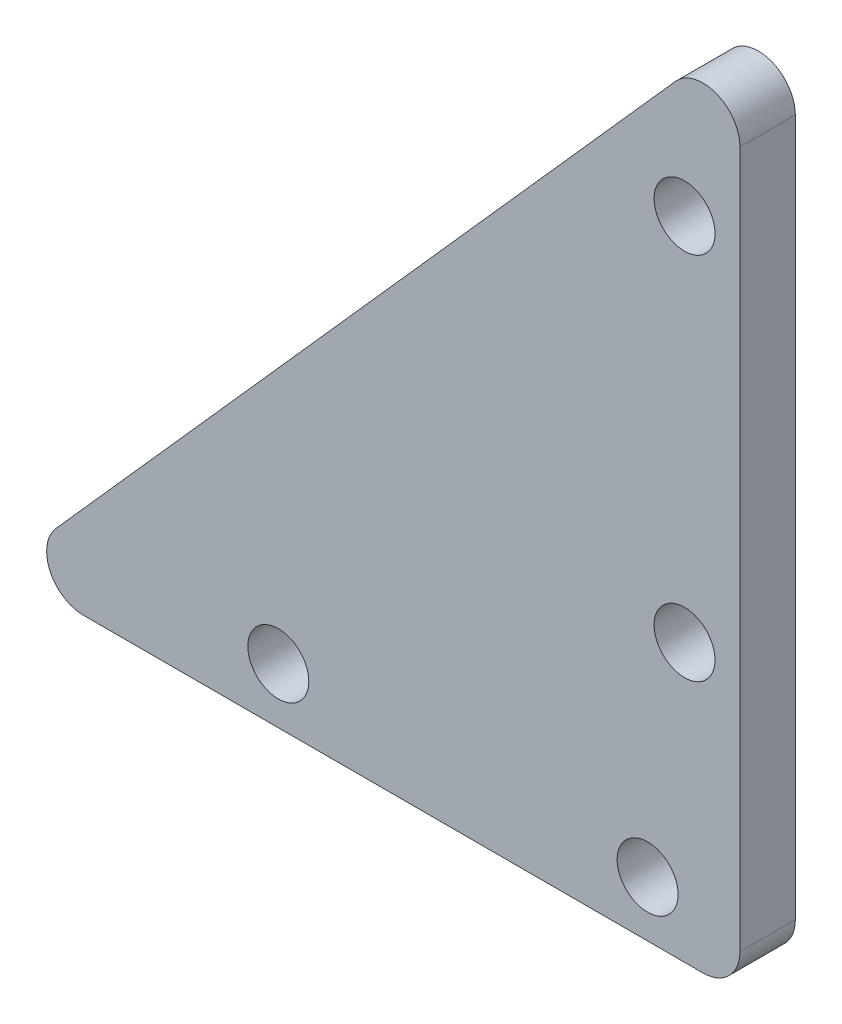
ISO-10303-21;
HEADER;
FILE_DESCRIPTION(('STEP AP214'),'2;1');
FILE_NAME('part.step','',(''),(''),'','','');
FILE_SCHEMA(('AUTOMOTIVE_DESIGN { 1 0 10303 214 1 1 1 1 }'));
ENDSEC;
DATA;
#1=APPLICATION_CONTEXT('core data for automotive mechanical design processes');
#2=APPLICATION_PROTOCOL_DEFINITION('international standard','automotive_design',2000,#1);
#3=PRODUCT_CONTEXT('',#1,'mechanical');
#4=PRODUCT('Part','Part','',(#3));
#5=PRODUCT_RELATED_PRODUCT_CATEGORY('part','',(#4));
#6=PRODUCT_DEFINITION_FORMATION('','',#4);
#7=PRODUCT_DEFINITION_CONTEXT('part definition',#1,'design');
#8=PRODUCT_DEFINITION('design','',#6,#7);
#9=PRODUCT_DEFINITION_SHAPE('','',#8);
#10=(LENGTH_UNIT() NAMED_UNIT(*) SI_UNIT(.MILLI.,.METRE.));
#11=(NAMED_UNIT(*) PLANE_ANGLE_UNIT() SI_UNIT($,.RADIAN.));
#12=(NAMED_UNIT(*) SI_UNIT($,.STERADIAN.) SOLID_ANGLE_UNIT());
#13=UNCERTAINTY_MEASURE_WITH_UNIT(LENGTH_MEASURE(1.E-05),#10,'distance_accuracy_value','');
#14=(GEOMETRIC_REPRESENTATION_CONTEXT(3) GLOBAL_UNCERTAINTY_ASSIGNED_CONTEXT((#13)) GLOBAL_UNIT_ASSIGNED_CONTEXT((#10,
#11,#12)) REPRESENTATION_CONTEXT('',''));
#15=CARTESIAN_POINT('',(0.,0.,0.));
#16=DIRECTION('',(0.,0.,1.));
#17=DIRECTION('',(1.,0.,0.));
#18=AXIS2_PLACEMENT_3D('',#15,#16,#17);
#19=CARTESIAN_POINT('',(0.,45.,3.));
#20=DIRECTION('',(-1.,0.,0.));
#21=DIRECTION('',(0.,-1.,0.));
#22=AXIS2_PLACEMENT_3D('',#19,#20,#21);
#23=PLANE('',#22);
#24=DIRECTION('',(0.,1.,0.));
#25=VECTOR('',#24,1.);
#26=CARTESIAN_POINT('',(0.,45.,3.));
#27=LINE('',#26,#25);
#28=CARTESIAN_POINT('',(0.,2.00000000000002,3.));
#29=VERTEX_POINT('',#28);
#30=CARTESIAN_POINT('',(0.,39.7396013553019,3.));
#31=VERTEX_POINT('',#30);
#32=EDGE_CURVE('E116',#29,#31,#27,.T.);
#33=ORIENTED_EDGE('',*,*,#32,.F.);
#34=DIRECTION('',(0.,0.,-1.));
#35=VECTOR('',#34,1.);
#36=CARTESIAN_POINT('',(0.,2.,3.));
#37=LINE('',#36,#35);
#38=CARTESIAN_POINT('',(0.,2.00000000000002,0.));
#39=VERTEX_POINT('',#38);
#40=EDGE_CURVE('E101',#29,#39,#37,.T.);
#41=ORIENTED_EDGE('',*,*,#40,.T.);
#42=DIRECTION('',(0.,1.,0.));
#43=VECTOR('',#42,1.);
#44=CARTESIAN_POINT('',(0.,45.,0.));
#45=LINE('',#44,#43);
#46=CARTESIAN_POINT('',(0.,39.7396013553019,0.));
#47=VERTEX_POINT('',#46);
#48=EDGE_CURVE('E114',#39,#47,#45,.T.);
#49=ORIENTED_EDGE('',*,*,#48,.T.);
#50=DIRECTION('',(0.,0.,-1.));
#51=VECTOR('',#50,1.);
#52=CARTESIAN_POINT('',(0.,39.7396013553019,3.));
#53=LINE('',#52,#51);
#54=EDGE_CURVE('E119',#47,#31,#53,.F.);
#55=ORIENTED_EDGE('',*,*,#54,.T.);
#56=EDGE_LOOP('',(#33,#41,#49,#55));
#57=FACE_BOUND('',#56,.T.);
#58=ADVANCED_FACE('F43',(#57),#23,.F.);
#59=CARTESIAN_POINT('',(-40.,0.,3.));
#60=DIRECTION('',(0.74740931868366,-0.66436383882992,0.));
#61=DIRECTION('',(0.66436383882992,0.74740931868366,0.));
#62=AXIS2_PLACEMENT_3D('',#59,#60,#61);
#63=PLANE('',#62);
#64=DIRECTION('',(-0.66436383882992,-0.74740931868366,0.));
#65=VECTOR('',#64,1.);
#66=CARTESIAN_POINT('',(-40.,0.,0.));
#67=LINE('',#66,#65);
#68=CARTESIAN_POINT('',(-3.49481863736732,41.0683290329618,0.));
#69=VERTEX_POINT('',#68);
#70=CARTESIAN_POINT('',(-37.0411309531913,3.32872767765984,0.));
#71=VERTEX_POINT('',#70);
#72=EDGE_CURVE('E124',#69,#71,#67,.T.);
#73=ORIENTED_EDGE('',*,*,#72,.T.);
#74=DIRECTION('',(0.,0.,-1.));
#75=VECTOR('',#74,1.);
#76=CARTESIAN_POINT('',(-37.0411309531913,3.32872767765984,3.));
#77=LINE('',#76,#75);
#78=CARTESIAN_POINT('',(-37.0411309531913,3.32872767765984,3.));
#79=VERTEX_POINT('',#78);
#80=EDGE_CURVE('E11',#71,#79,#77,.F.);
#81=ORIENTED_EDGE('',*,*,#80,.T.);
#82=DIRECTION('',(-0.66436383882992,-0.74740931868366,0.));
#83=VECTOR('',#82,1.);
#84=CARTESIAN_POINT('',(-40.,0.,3.));
#85=LINE('',#84,#83);
#86=CARTESIAN_POINT('',(-3.49481863736732,41.0683290329618,3.));
#87=VERTEX_POINT('',#86);
#88=EDGE_CURVE('E162',#87,#79,#85,.T.);
#89=ORIENTED_EDGE('',*,*,#88,.F.);
#90=DIRECTION('',(0.,0.,-1.));
#91=VECTOR('',#90,1.);
#92=CARTESIAN_POINT('',(-3.49481863736732,41.0683290329618,3.));
#93=LINE('',#92,#91);
#94=EDGE_CURVE('E52',#87,#69,#93,.T.);
#95=ORIENTED_EDGE('',*,*,#94,.T.);
#96=EDGE_LOOP('',(#73,#81,#89,#95));
#97=FACE_BOUND('',#96,.T.);
#98=ADVANCED_FACE('F161',(#97),#63,.F.);
#99=CARTESIAN_POINT('',(0.,0.,3.));
#100=DIRECTION('',(0.,1.,0.));
#101=DIRECTION('',(-1.,0.,0.));
#102=AXIS2_PLACEMENT_3D('',#99,#100,#101);
#103=PLANE('',#102);
#104=DIRECTION('',(1.,0.,0.));
#105=VECTOR('',#104,1.);
#106=CARTESIAN_POINT('',(0.,0.,0.));
#107=LINE('',#106,#105);
#108=CARTESIAN_POINT('',(-35.5463123158239,0.,0.));
#109=VERTEX_POINT('',#108);
#110=CARTESIAN_POINT('',(-2.,0.,0.));
#111=VERTEX_POINT('',#110);
#112=EDGE_CURVE('E129',#109,#111,#107,.T.);
#113=ORIENTED_EDGE('',*,*,#112,.T.);
#114=DIRECTION('',(0.,0.,-1.));
#115=VECTOR('',#114,1.);
#116=CARTESIAN_POINT('',(-2.,0.,3.));
#117=LINE('',#116,#115);
#118=CARTESIAN_POINT('',(-2.,0.,3.));
#119=VERTEX_POINT('',#118);
#120=EDGE_CURVE('E102',#111,#119,#117,.F.);
#121=ORIENTED_EDGE('',*,*,#120,.T.);
#122=DIRECTION('',(1.,0.,0.));
#123=VECTOR('',#122,1.);
#124=CARTESIAN_POINT('',(0.,0.,3.));
#125=LINE('',#124,#123);
#126=CARTESIAN_POINT('',(-35.5463123158239,0.,3.));
#127=VERTEX_POINT('',#126);
#128=EDGE_CURVE('E135',#127,#119,#125,.T.);
#129=ORIENTED_EDGE('',*,*,#128,.F.);
#130=DIRECTION('',(0.,0.,-1.));
#131=VECTOR('',#130,1.);
#132=CARTESIAN_POINT('',(-35.5463123158239,0.,3.));
#133=LINE('',#132,#131);
#134=EDGE_CURVE('E108',#127,#109,#133,.T.);
#135=ORIENTED_EDGE('',*,*,#134,.T.);
#136=EDGE_LOOP('',(#113,#121,#129,#135));
#137=FACE_BOUND('',#136,.T.);
#138=ADVANCED_FACE('F170',(#137),#103,.F.);
#139=CARTESIAN_POINT('',(0.,0.,3.));
#140=DIRECTION('',(0.,0.,-1.));
#141=DIRECTION('',(-1.,0.,0.));
#142=AXIS2_PLACEMENT_3D('',#139,#140,#141);
#143=PLANE('',#142);
#144=CARTESIAN_POINT('',(-3.,15.,3.));
#145=DIRECTION('',(0.,0.,1.));
#146=DIRECTION('',(1.,0.,0.));
#147=AXIS2_PLACEMENT_3D('',#144,#145,#146);
#148=CIRCLE('',#147,1.65);
#149=CARTESIAN_POINT('',(-1.35,15.,3.));
#150=VERTEX_POINT('',#149);
#151=EDGE_CURVE('E197',#150,#150,#148,.T.);
#152=ORIENTED_EDGE('',*,*,#151,.F.);
#153=EDGE_LOOP('',(#152));
#154=FACE_BOUND('',#153,.T.);
#155=CARTESIAN_POINT('',(-3.,35.,3.));
#156=DIRECTION('',(0.,0.,1.));
#157=DIRECTION('',(1.,0.,0.));
#158=AXIS2_PLACEMENT_3D('',#155,#156,#157);
#159=CIRCLE('',#158,1.65);
#160=CARTESIAN_POINT('',(-1.35,35.,3.));
#161=VERTEX_POINT('',#160);
#162=EDGE_CURVE('E193',#161,#161,#159,.T.);
#163=ORIENTED_EDGE('',*,*,#162,.F.);
#164=EDGE_LOOP('',(#163));
#165=FACE_BOUND('',#164,.T.);
#166=CARTESIAN_POINT('',(-5.,3.,3.));
#167=DIRECTION('',(0.,0.,1.));
#168=DIRECTION('',(1.,0.,0.));
#169=AXIS2_PLACEMENT_3D('',#166,#167,#168);
#170=CIRCLE('',#169,1.65);
#171=CARTESIAN_POINT('',(-3.35,3.,3.));
#172=VERTEX_POINT('',#171);
#173=EDGE_CURVE('E132',#172,#172,#170,.T.);
#174=ORIENTED_EDGE('',*,*,#173,.F.);
#175=EDGE_LOOP('',(#174));
#176=FACE_BOUND('',#175,.T.);
#177=CARTESIAN_POINT('',(-25.,3.,3.));
#178=DIRECTION('',(0.,0.,1.));
#179=DIRECTION('',(1.,0.,0.));
#180=AXIS2_PLACEMENT_3D('',#177,#178,#179);
#181=CIRCLE('',#180,1.65);
#182=CARTESIAN_POINT('',(-23.35,3.,3.));
#183=VERTEX_POINT('',#182);
#184=EDGE_CURVE('E181',#183,#183,#181,.T.);
#185=ORIENTED_EDGE('',*,*,#184,.F.);
#186=EDGE_LOOP('',(#185));
#187=FACE_BOUND('',#186,.T.);
#188=ORIENTED_EDGE('',*,*,#128,.T.);
#189=CARTESIAN_POINT('',(-2.,2.,3.));
#190=DIRECTION('',(0.,0.,-1.));
#191=DIRECTION('',(-1.,0.,0.));
#192=AXIS2_PLACEMENT_3D('',#189,#190,#191);
#193=CIRCLE('',#192,2.);
#194=EDGE_CURVE('E156',#119,#29,#193,.F.);
#195=ORIENTED_EDGE('',*,*,#194,.T.);
#196=ORIENTED_EDGE('',*,*,#32,.T.);
#197=CARTESIAN_POINT('',(-2.,39.7396013553019,3.));
#198=DIRECTION('',(0.,0.,-1.));
#199=DIRECTION('',(-1.,0.,0.));
#200=AXIS2_PLACEMENT_3D('',#197,#198,#199);
#201=CIRCLE('',#200,2.);
#202=EDGE_CURVE('E64',#31,#87,#201,.F.);
#203=ORIENTED_EDGE('',*,*,#202,.T.);
#204=ORIENTED_EDGE('',*,*,#88,.T.);
#205=CARTESIAN_POINT('',(-35.5463123158239,2.,3.));
#206=DIRECTION('',(0.,0.,-1.));
#207=DIRECTION('',(-1.,0.,0.));
#208=AXIS2_PLACEMENT_3D('',#205,#206,#207);
#209=CIRCLE('',#208,2.);
#210=EDGE_CURVE('E153',#79,#127,#209,.F.);
#211=ORIENTED_EDGE('',*,*,#210,.T.);
#212=EDGE_LOOP('',(#188,#195,#196,#203,#204,#211));
#213=FACE_BOUND('',#212,.T.);
#214=ADVANCED_FACE('F214',(#154,#165,#176,#187,#213),#143,.F.);
#215=CARTESIAN_POINT('',(0.,0.,0.));
#216=DIRECTION('',(0.,0.,-1.));
#217=DIRECTION('',(-1.,0.,0.));
#218=AXIS2_PLACEMENT_3D('',#215,#216,#217);
#219=PLANE('',#218);
#220=CARTESIAN_POINT('',(-3.,15.,0.));
#221=DIRECTION('',(0.,0.,1.));
#222=DIRECTION('',(1.,0.,0.));
#223=AXIS2_PLACEMENT_3D('',#220,#221,#222);
#224=CIRCLE('',#223,1.65);
#225=CARTESIAN_POINT('',(-1.35,15.,0.));
#226=VERTEX_POINT('',#225);
#227=EDGE_CURVE('E182',#226,#226,#224,.T.);
#228=ORIENTED_EDGE('',*,*,#227,.T.);
#229=EDGE_LOOP('',(#228));
#230=FACE_BOUND('',#229,.T.);
#231=CARTESIAN_POINT('',(-3.,35.,0.));
#232=DIRECTION('',(0.,0.,1.));
#233=DIRECTION('',(1.,0.,0.));
#234=AXIS2_PLACEMENT_3D('',#231,#232,#233);
#235=CIRCLE('',#234,1.65);
#236=CARTESIAN_POINT('',(-1.35,35.,0.));
#237=VERTEX_POINT('',#236);
#238=EDGE_CURVE('E189',#237,#237,#235,.T.);
#239=ORIENTED_EDGE('',*,*,#238,.T.);
#240=EDGE_LOOP('',(#239));
#241=FACE_BOUND('',#240,.T.);
#242=CARTESIAN_POINT('',(-5.,3.,0.));
#243=DIRECTION('',(0.,0.,1.));
#244=DIRECTION('',(1.,0.,0.));
#245=AXIS2_PLACEMENT_3D('',#242,#243,#244);
#246=CIRCLE('',#245,1.65);
#247=CARTESIAN_POINT('',(-3.35,3.,0.));
#248=VERTEX_POINT('',#247);
#249=EDGE_CURVE('E125',#248,#248,#246,.T.);
#250=ORIENTED_EDGE('',*,*,#249,.T.);
#251=EDGE_LOOP('',(#250));
#252=FACE_BOUND('',#251,.T.);
#253=CARTESIAN_POINT('',(-25.,3.,0.));
#254=DIRECTION('',(0.,0.,1.));
#255=DIRECTION('',(1.,0.,0.));
#256=AXIS2_PLACEMENT_3D('',#253,#254,#255);
#257=CIRCLE('',#256,1.65);
#258=CARTESIAN_POINT('',(-23.35,3.,0.));
#259=VERTEX_POINT('',#258);
#260=EDGE_CURVE('E177',#259,#259,#257,.T.);
#261=ORIENTED_EDGE('',*,*,#260,.T.);
#262=EDGE_LOOP('',(#261));
#263=FACE_BOUND('',#262,.T.);
#264=ORIENTED_EDGE('',*,*,#48,.F.);
#265=CARTESIAN_POINT('',(-2.,2.,0.));
#266=DIRECTION('',(0.,0.,-1.));
#267=DIRECTION('',(-1.,0.,0.));
#268=AXIS2_PLACEMENT_3D('',#265,#266,#267);
#269=CIRCLE('',#268,2.);
#270=EDGE_CURVE('E97',#39,#111,#269,.T.);
#271=ORIENTED_EDGE('',*,*,#270,.T.);
#272=ORIENTED_EDGE('',*,*,#112,.F.);
#273=CARTESIAN_POINT('',(-35.5463123158239,2.,0.));
#274=DIRECTION('',(0.,0.,-1.));
#275=DIRECTION('',(-1.,0.,0.));
#276=AXIS2_PLACEMENT_3D('',#273,#274,#275);
#277=CIRCLE('',#276,2.);
#278=EDGE_CURVE('E109',#109,#71,#277,.T.);
#279=ORIENTED_EDGE('',*,*,#278,.T.);
#280=ORIENTED_EDGE('',*,*,#72,.F.);
#281=CARTESIAN_POINT('',(-2.,39.7396013553019,0.));
#282=DIRECTION('',(0.,0.,-1.));
#283=DIRECTION('',(-1.,0.,0.));
#284=AXIS2_PLACEMENT_3D('',#281,#282,#283);
#285=CIRCLE('',#284,2.);
#286=EDGE_CURVE('E118',#69,#47,#285,.T.);
#287=ORIENTED_EDGE('',*,*,#286,.T.);
#288=EDGE_LOOP('',(#264,#271,#272,#279,#280,#287));
#289=FACE_BOUND('',#288,.T.);
#290=ADVANCED_FACE('F121',(#230,#241,#252,#263,#289),#219,.T.);
#291=CARTESIAN_POINT('',(-25.,3.,0.));
#292=DIRECTION('',(0.,0.,1.));
#293=DIRECTION('',(1.,0.,0.));
#294=AXIS2_PLACEMENT_3D('',#291,#292,#293);
#295=CYLINDRICAL_SURFACE('',#294,1.65);
#296=ORIENTED_EDGE('',*,*,#260,.F.);
#297=EDGE_LOOP('',(#296));
#298=FACE_BOUND('',#297,.T.);
#299=ORIENTED_EDGE('',*,*,#184,.T.);
#300=EDGE_LOOP('',(#299));
#301=FACE_BOUND('',#300,.T.);
#302=ADVANCED_FACE('F224',(#298,#301),#295,.F.);
#303=CARTESIAN_POINT('',(-5.,3.,0.));
#304=DIRECTION('',(0.,0.,1.));
#305=DIRECTION('',(1.,0.,0.));
#306=AXIS2_PLACEMENT_3D('',#303,#304,#305);
#307=CYLINDRICAL_SURFACE('',#306,1.65);
#308=ORIENTED_EDGE('',*,*,#249,.F.);
#309=EDGE_LOOP('',(#308));
#310=FACE_BOUND('',#309,.T.);
#311=ORIENTED_EDGE('',*,*,#173,.T.);
#312=EDGE_LOOP('',(#311));
#313=FACE_BOUND('',#312,.T.);
#314=ADVANCED_FACE('F226',(#310,#313),#307,.F.);
#315=CARTESIAN_POINT('',(-3.,35.,0.));
#316=DIRECTION('',(0.,0.,1.));
#317=DIRECTION('',(1.,0.,0.));
#318=AXIS2_PLACEMENT_3D('',#315,#316,#317);
#319=CYLINDRICAL_SURFACE('',#318,1.65);
#320=ORIENTED_EDGE('',*,*,#238,.F.);
#321=EDGE_LOOP('',(#320));
#322=FACE_BOUND('',#321,.T.);
#323=ORIENTED_EDGE('',*,*,#162,.T.);
#324=EDGE_LOOP('',(#323));
#325=FACE_BOUND('',#324,.T.);
#326=ADVANCED_FACE('F210',(#322,#325),#319,.F.);
#327=CARTESIAN_POINT('',(-3.,15.,0.));
#328=DIRECTION('',(0.,0.,1.));
#329=DIRECTION('',(1.,0.,0.));
#330=AXIS2_PLACEMENT_3D('',#327,#328,#329);
#331=CYLINDRICAL_SURFACE('',#330,1.65);
#332=ORIENTED_EDGE('',*,*,#227,.F.);
#333=EDGE_LOOP('',(#332));
#334=FACE_BOUND('',#333,.T.);
#335=ORIENTED_EDGE('',*,*,#151,.T.);
#336=EDGE_LOOP('',(#335));
#337=FACE_BOUND('',#336,.T.);
#338=ADVANCED_FACE('F207',(#334,#337),#331,.F.);
#339=CARTESIAN_POINT('',(-2.,2.,3.));
#340=DIRECTION('',(0.,0.,-1.));
#341=DIRECTION('',(-1.,0.,0.));
#342=AXIS2_PLACEMENT_3D('',#339,#340,#341);
#343=CYLINDRICAL_SURFACE('',#342,2.);
#344=ORIENTED_EDGE('',*,*,#194,.F.);
#345=ORIENTED_EDGE('',*,*,#120,.F.);
#346=ORIENTED_EDGE('',*,*,#270,.F.);
#347=ORIENTED_EDGE('',*,*,#40,.F.);
#348=EDGE_LOOP('',(#344,#345,#346,#347));
#349=FACE_BOUND('',#348,.T.);
#350=ADVANCED_FACE('F100',(#349),#343,.T.);
#351=CARTESIAN_POINT('',(-35.5463123158239,2.,3.));
#352=DIRECTION('',(0.,0.,-1.));
#353=DIRECTION('',(-1.,0.,0.));
#354=AXIS2_PLACEMENT_3D('',#351,#352,#353);
#355=CYLINDRICAL_SURFACE('',#354,2.);
#356=ORIENTED_EDGE('',*,*,#210,.F.);
#357=ORIENTED_EDGE('',*,*,#80,.F.);
#358=ORIENTED_EDGE('',*,*,#278,.F.);
#359=ORIENTED_EDGE('',*,*,#134,.F.);
#360=EDGE_LOOP('',(#356,#357,#358,#359));
#361=FACE_BOUND('',#360,.T.);
#362=ADVANCED_FACE('F167',(#361),#355,.T.);
#363=CARTESIAN_POINT('',(-2.,39.7396013553019,3.));
#364=DIRECTION('',(0.,0.,-1.));
#365=DIRECTION('',(-1.,0.,0.));
#366=AXIS2_PLACEMENT_3D('',#363,#364,#365);
#367=CYLINDRICAL_SURFACE('',#366,2.);
#368=ORIENTED_EDGE('',*,*,#202,.F.);
#369=ORIENTED_EDGE('',*,*,#54,.F.);
#370=ORIENTED_EDGE('',*,*,#286,.F.);
#371=ORIENTED_EDGE('',*,*,#94,.F.);
#372=EDGE_LOOP('',(#368,#369,#370,#371));
#373=FACE_BOUND('',#372,.T.);
#374=ADVANCED_FACE('F45',(#373),#367,.T.);
#375=CLOSED_SHELL('',(#58,#98,#138,#214,#290,#302,#314,#326,#338,#350,#362,#374));
#376=MANIFOLD_SOLID_BREP('B2',#375);
#377=ADVANCED_BREP_SHAPE_REPRESENTATION('',(#18,#376),#14);
#378=SHAPE_DEFINITION_REPRESENTATION(#9,#377);
ENDSEC;
END-ISO-10303-21;
